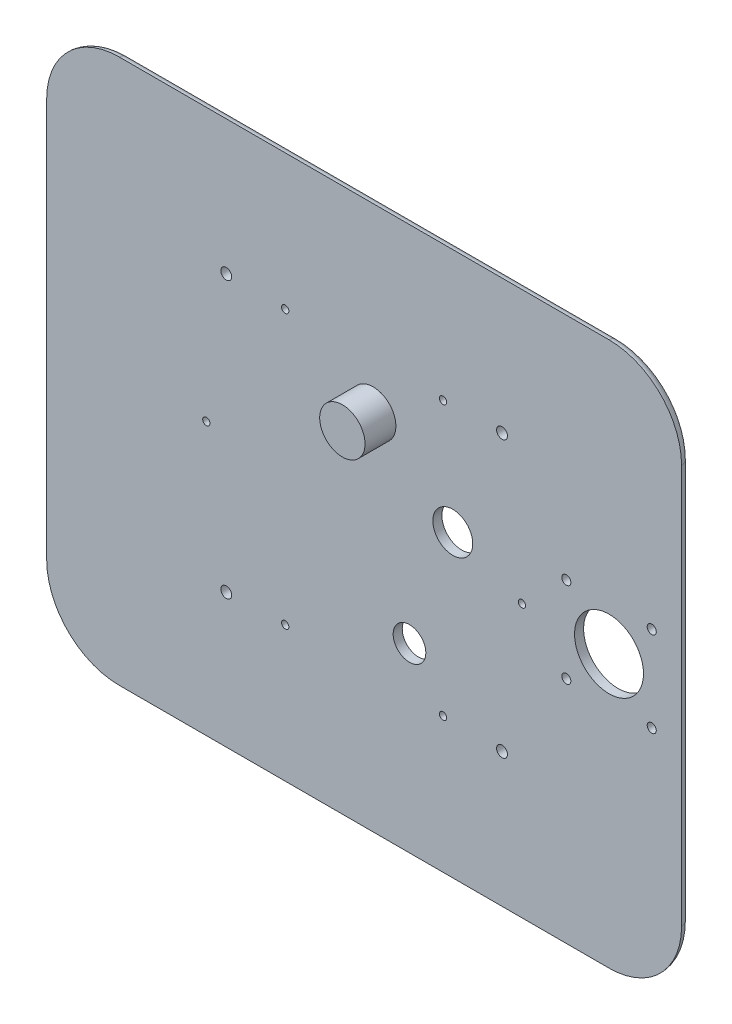
ISO-10303-21;
HEADER;
FILE_DESCRIPTION(('STEP AP214'),'2;1');
FILE_NAME('part.step','',(''),(''),'','','');
FILE_SCHEMA(('AUTOMOTIVE_DESIGN { 1 0 10303 214 1 1 1 1 }'));
ENDSEC;
DATA;
#1=APPLICATION_CONTEXT('core data for automotive mechanical design processes');
#2=APPLICATION_PROTOCOL_DEFINITION('international standard','automotive_design',2000,#1);
#3=PRODUCT_CONTEXT('',#1,'mechanical');
#4=PRODUCT('Part','Part','',(#3));
#5=PRODUCT_RELATED_PRODUCT_CATEGORY('part','',(#4));
#6=PRODUCT_DEFINITION_FORMATION('','',#4);
#7=PRODUCT_DEFINITION_CONTEXT('part definition',#1,'design');
#8=PRODUCT_DEFINITION('design','',#6,#7);
#9=PRODUCT_DEFINITION_SHAPE('','',#8);
#10=(LENGTH_UNIT() NAMED_UNIT(*) SI_UNIT(.MILLI.,.METRE.));
#11=(NAMED_UNIT(*) PLANE_ANGLE_UNIT() SI_UNIT($,.RADIAN.));
#12=(NAMED_UNIT(*) SI_UNIT($,.STERADIAN.) SOLID_ANGLE_UNIT());
#13=UNCERTAINTY_MEASURE_WITH_UNIT(LENGTH_MEASURE(1.E-05),#10,'distance_accuracy_value','');
#14=(GEOMETRIC_REPRESENTATION_CONTEXT(3) GLOBAL_UNCERTAINTY_ASSIGNED_CONTEXT((#13)) GLOBAL_UNIT_ASSIGNED_CONTEXT((#10,
#11,#12)) REPRESENTATION_CONTEXT('',''));
#15=CARTESIAN_POINT('',(0.,0.,0.));
#16=DIRECTION('',(0.,0.,1.));
#17=DIRECTION('',(1.,0.,0.));
#18=AXIS2_PLACEMENT_3D('',#15,#16,#17);
#19=CARTESIAN_POINT('',(0.,0.,5.));
#20=DIRECTION('',(0.,0.,1.));
#21=DIRECTION('',(1.,0.,0.));
#22=AXIS2_PLACEMENT_3D('',#19,#20,#21);
#23=PLANE('',#22);
#24=CARTESIAN_POINT('',(158.55,23.5499999999998,5.));
#25=DIRECTION('',(0.,0.,1.));
#26=DIRECTION('',(1.,0.,0.));
#27=AXIS2_PLACEMENT_3D('',#24,#25,#26);
#28=CIRCLE('',#27,2.49999999999999);
#29=CARTESIAN_POINT('',(161.05,23.5499999999998,5.));
#30=VERTEX_POINT('',#29);
#31=EDGE_CURVE('E171',#30,#30,#28,.T.);
#32=ORIENTED_EDGE('',*,*,#31,.F.);
#33=EDGE_LOOP('',(#32));
#34=FACE_BOUND('',#33,.T.);
#35=CARTESIAN_POINT('',(111.45,-23.5499999999999,5.));
#36=DIRECTION('',(0.,0.,1.));
#37=DIRECTION('',(1.,0.,0.));
#38=AXIS2_PLACEMENT_3D('',#35,#36,#37);
#39=CIRCLE('',#38,2.49999999999999);
#40=CARTESIAN_POINT('',(113.95,-23.5499999999999,5.));
#41=VERTEX_POINT('',#40);
#42=EDGE_CURVE('E185',#41,#41,#39,.T.);
#43=ORIENTED_EDGE('',*,*,#42,.F.);
#44=EDGE_LOOP('',(#43));
#45=FACE_BOUND('',#44,.T.);
#46=CARTESIAN_POINT('',(-76.0129579413931,76.015,5.));
#47=DIRECTION('',(0.,0.,1.));
#48=DIRECTION('',(1.,0.,0.));
#49=AXIS2_PLACEMENT_3D('',#46,#47,#48);
#50=CIRCLE('',#49,3.00000000000001);
#51=CARTESIAN_POINT('',(-73.0129579413931,76.015,5.));
#52=VERTEX_POINT('',#51);
#53=EDGE_CURVE('E197',#52,#52,#50,.T.);
#54=ORIENTED_EDGE('',*,*,#53,.F.);
#55=EDGE_LOOP('',(#54));
#56=FACE_BOUND('',#55,.T.);
#57=CARTESIAN_POINT('',(158.55,-23.55,5.));
#58=DIRECTION('',(0.,0.,1.));
#59=DIRECTION('',(1.,0.,0.));
#60=AXIS2_PLACEMENT_3D('',#57,#58,#59);
#61=CIRCLE('',#60,2.5);
#62=CARTESIAN_POINT('',(161.05,-23.55,5.));
#63=VERTEX_POINT('',#62);
#64=EDGE_CURVE('E209',#63,#63,#61,.T.);
#65=ORIENTED_EDGE('',*,*,#64,.F.);
#66=EDGE_LOOP('',(#65));
#67=FACE_BOUND('',#66,.T.);
#68=CARTESIAN_POINT('',(-76.0129579413931,-76.015,5.));
#69=DIRECTION('',(0.,0.,1.));
#70=DIRECTION('',(1.,0.,0.));
#71=AXIS2_PLACEMENT_3D('',#68,#69,#70);
#72=CIRCLE('',#71,3.00000000000001);
#73=CARTESIAN_POINT('',(-73.0129579413931,-76.015,5.));
#74=VERTEX_POINT('',#73);
#75=EDGE_CURVE('E221',#74,#74,#72,.T.);
#76=ORIENTED_EDGE('',*,*,#75,.F.);
#77=EDGE_LOOP('',(#76));
#78=FACE_BOUND('',#77,.T.);
#79=CARTESIAN_POINT('',(-43.4999999999998,-75.3442101292462,5.));
#80=DIRECTION('',(0.,0.,1.));
#81=DIRECTION('',(1.,0.,0.));
#82=AXIS2_PLACEMENT_3D('',#79,#80,#81);
#83=CIRCLE('',#82,2.);
#84=CARTESIAN_POINT('',(-41.4999999999998,-75.3442101292462,5.));
#85=VERTEX_POINT('',#84);
#86=EDGE_CURVE('E233',#85,#85,#83,.T.);
#87=ORIENTED_EDGE('',*,*,#86,.F.);
#88=EDGE_LOOP('',(#87));
#89=FACE_BOUND('',#88,.T.);
#90=CARTESIAN_POINT('',(87.,1.76012159040676E-13,5.));
#91=DIRECTION('',(0.,0.,1.));
#92=DIRECTION('',(1.,0.,0.));
#93=AXIS2_PLACEMENT_3D('',#90,#91,#92);
#94=CIRCLE('',#93,2.);
#95=CARTESIAN_POINT('',(89.,1.76012159040676E-13,5.));
#96=VERTEX_POINT('',#95);
#97=EDGE_CURVE('E245',#96,#96,#94,.T.);
#98=ORIENTED_EDGE('',*,*,#97,.F.);
#99=EDGE_LOOP('',(#98));
#100=FACE_BOUND('',#99,.T.);
#101=CARTESIAN_POINT('',(-43.5000000000002,75.3442101292461,5.));
#102=DIRECTION('',(0.,0.,1.));
#103=DIRECTION('',(1.,0.,0.));
#104=AXIS2_PLACEMENT_3D('',#101,#102,#103);
#105=CIRCLE('',#104,2.00000000000012);
#106=CARTESIAN_POINT('',(-41.5000000000001,75.3442101292461,5.));
#107=VERTEX_POINT('',#106);
#108=EDGE_CURVE('E257',#107,#107,#105,.T.);
#109=ORIENTED_EDGE('',*,*,#108,.F.);
#110=EDGE_LOOP('',(#109));
#111=FACE_BOUND('',#110,.T.);
#112=DIRECTION('',(0.,1.,0.));
#113=VECTOR('',#112,1.);
#114=CARTESIAN_POINT('',(175.,150.,5.));
#115=LINE('',#114,#113);
#116=CARTESIAN_POINT('',(175.,-110.,5.));
#117=VERTEX_POINT('',#116);
#118=CARTESIAN_POINT('',(175.,110.,5.));
#119=VERTEX_POINT('',#118);
#120=EDGE_CURVE('E116',#117,#119,#115,.T.);
#121=ORIENTED_EDGE('',*,*,#120,.T.);
#122=CARTESIAN_POINT('',(135.,110.,5.));
#123=DIRECTION('',(0.,0.,1.));
#124=DIRECTION('',(1.,0.,0.));
#125=AXIS2_PLACEMENT_3D('',#122,#123,#124);
#126=CIRCLE('',#125,40.);
#127=CARTESIAN_POINT('',(135.,150.,5.));
#128=VERTEX_POINT('',#127);
#129=EDGE_CURVE('E103',#119,#128,#126,.T.);
#130=ORIENTED_EDGE('',*,*,#129,.T.);
#131=DIRECTION('',(-1.,0.,0.));
#132=VECTOR('',#131,1.);
#133=CARTESIAN_POINT('',(-175.,150.,5.));
#134=LINE('',#133,#132);
#135=CARTESIAN_POINT('',(-135.,150.,5.));
#136=VERTEX_POINT('',#135);
#137=EDGE_CURVE('E109',#128,#136,#134,.T.);
#138=ORIENTED_EDGE('',*,*,#137,.T.);
#139=CARTESIAN_POINT('',(-135.,110.,5.));
#140=DIRECTION('',(0.,0.,1.));
#141=DIRECTION('',(1.,0.,0.));
#142=AXIS2_PLACEMENT_3D('',#139,#140,#141);
#143=CIRCLE('',#142,40.);
#144=CARTESIAN_POINT('',(-175.,110.,5.));
#145=VERTEX_POINT('',#144);
#146=EDGE_CURVE('E121',#136,#145,#143,.T.);
#147=ORIENTED_EDGE('',*,*,#146,.T.);
#148=DIRECTION('',(0.,-1.,0.));
#149=VECTOR('',#148,1.);
#150=CARTESIAN_POINT('',(-175.,150.,5.));
#151=LINE('',#150,#149);
#152=CARTESIAN_POINT('',(-175.,-110.,5.));
#153=VERTEX_POINT('',#152);
#154=EDGE_CURVE('E115',#145,#153,#151,.T.);
#155=ORIENTED_EDGE('',*,*,#154,.T.);
#156=CARTESIAN_POINT('',(-135.,-110.,5.));
#157=DIRECTION('',(0.,0.,1.));
#158=DIRECTION('',(1.,0.,0.));
#159=AXIS2_PLACEMENT_3D('',#156,#157,#158);
#160=CIRCLE('',#159,40.);
#161=CARTESIAN_POINT('',(-135.,-150.,5.));
#162=VERTEX_POINT('',#161);
#163=EDGE_CURVE('E125',#153,#162,#160,.T.);
#164=ORIENTED_EDGE('',*,*,#163,.T.);
#165=DIRECTION('',(1.,0.,0.));
#166=VECTOR('',#165,1.);
#167=CARTESIAN_POINT('',(-175.,-150.,5.));
#168=LINE('',#167,#166);
#169=CARTESIAN_POINT('',(135.,-150.,5.));
#170=VERTEX_POINT('',#169);
#171=EDGE_CURVE('E264',#162,#170,#168,.T.);
#172=ORIENTED_EDGE('',*,*,#171,.T.);
#173=CARTESIAN_POINT('',(135.,-110.,5.));
#174=DIRECTION('',(0.,0.,1.));
#175=DIRECTION('',(1.,0.,0.));
#176=AXIS2_PLACEMENT_3D('',#173,#174,#175);
#177=CIRCLE('',#176,40.);
#178=EDGE_CURVE('E266',#170,#117,#177,.T.);
#179=ORIENTED_EDGE('',*,*,#178,.T.);
#180=EDGE_LOOP('',(#121,#130,#138,#147,#155,#164,#172,#179));
#181=FACE_BOUND('',#180,.T.);
#182=CARTESIAN_POINT('',(43.4999999999998,75.3442101292462,5.));
#183=DIRECTION('',(0.,0.,1.));
#184=DIRECTION('',(1.,0.,0.));
#185=AXIS2_PLACEMENT_3D('',#182,#183,#184);
#186=CIRCLE('',#185,2.);
#187=CARTESIAN_POINT('',(45.4999999999998,75.3442101292462,5.));
#188=VERTEX_POINT('',#187);
#189=EDGE_CURVE('E251',#188,#188,#186,.T.);
#190=ORIENTED_EDGE('',*,*,#189,.F.);
#191=EDGE_LOOP('',(#190));
#192=FACE_BOUND('',#191,.T.);
#193=CARTESIAN_POINT('',(43.5000000000001,-75.3442101292461,5.));
#194=DIRECTION('',(0.,0.,1.));
#195=DIRECTION('',(1.,0.,0.));
#196=AXIS2_PLACEMENT_3D('',#193,#194,#195);
#197=CIRCLE('',#196,2.);
#198=CARTESIAN_POINT('',(45.5000000000001,-75.3442101292461,5.));
#199=VERTEX_POINT('',#198);
#200=EDGE_CURVE('E239',#199,#199,#197,.T.);
#201=ORIENTED_EDGE('',*,*,#200,.F.);
#202=EDGE_LOOP('',(#201));
#203=FACE_BOUND('',#202,.T.);
#204=CARTESIAN_POINT('',(-87.,-2.24584416368026E-13,5.));
#205=DIRECTION('',(0.,0.,1.));
#206=DIRECTION('',(1.,0.,0.));
#207=AXIS2_PLACEMENT_3D('',#204,#205,#206);
#208=CIRCLE('',#207,2.);
#209=CARTESIAN_POINT('',(-85.,-2.24584416368026E-13,5.));
#210=VERTEX_POINT('',#209);
#211=EDGE_CURVE('E227',#210,#210,#208,.T.);
#212=ORIENTED_EDGE('',*,*,#211,.F.);
#213=EDGE_LOOP('',(#212));
#214=FACE_BOUND('',#213,.T.);
#215=CARTESIAN_POINT('',(135.,0.,5.));
#216=DIRECTION('',(0.,0.,1.));
#217=DIRECTION('',(1.,0.,0.));
#218=AXIS2_PLACEMENT_3D('',#215,#216,#217);
#219=CIRCLE('',#218,19.);
#220=CARTESIAN_POINT('',(154.,0.,5.));
#221=VERTEX_POINT('',#220);
#222=EDGE_CURVE('E215',#221,#221,#219,.T.);
#223=ORIENTED_EDGE('',*,*,#222,.F.);
#224=EDGE_LOOP('',(#223));
#225=FACE_BOUND('',#224,.T.);
#226=CARTESIAN_POINT('',(76.0129579413931,76.015,5.));
#227=DIRECTION('',(0.,0.,1.));
#228=DIRECTION('',(1.,0.,0.));
#229=AXIS2_PLACEMENT_3D('',#226,#227,#228);
#230=CIRCLE('',#229,3.00000000000001);
#231=CARTESIAN_POINT('',(79.0129579413931,76.015,5.));
#232=VERTEX_POINT('',#231);
#233=EDGE_CURVE('E203',#232,#232,#230,.T.);
#234=ORIENTED_EDGE('',*,*,#233,.F.);
#235=EDGE_LOOP('',(#234));
#236=FACE_BOUND('',#235,.T.);
#237=CARTESIAN_POINT('',(76.0129579413931,-76.015,5.));
#238=DIRECTION('',(0.,0.,1.));
#239=DIRECTION('',(1.,0.,0.));
#240=AXIS2_PLACEMENT_3D('',#237,#238,#239);
#241=CIRCLE('',#240,3.00000000000001);
#242=CARTESIAN_POINT('',(79.0129579413931,-76.015,5.));
#243=VERTEX_POINT('',#242);
#244=EDGE_CURVE('E191',#243,#243,#241,.T.);
#245=ORIENTED_EDGE('',*,*,#244,.F.);
#246=EDGE_LOOP('',(#245));
#247=FACE_BOUND('',#246,.T.);
#248=CARTESIAN_POINT('',(111.45,23.5500000000002,5.));
#249=DIRECTION('',(0.,0.,1.));
#250=DIRECTION('',(1.,0.,0.));
#251=AXIS2_PLACEMENT_3D('',#248,#249,#250);
#252=CIRCLE('',#251,2.49999999999999);
#253=CARTESIAN_POINT('',(113.95,23.5500000000002,5.));
#254=VERTEX_POINT('',#253);
#255=EDGE_CURVE('E179',#254,#254,#252,.T.);
#256=ORIENTED_EDGE('',*,*,#255,.F.);
#257=EDGE_LOOP('',(#256));
#258=FACE_BOUND('',#257,.T.);
#259=CARTESIAN_POINT('',(25.,-50.,5.));
#260=DIRECTION('',(0.,0.,1.));
#261=DIRECTION('',(1.,0.,0.));
#262=AXIS2_PLACEMENT_3D('',#259,#260,#261);
#263=CIRCLE('',#262,9.);
#264=CARTESIAN_POINT('',(34.,-50.,5.));
#265=VERTEX_POINT('',#264);
#266=EDGE_CURVE('E162',#265,#265,#263,.F.);
#267=ORIENTED_EDGE('',*,*,#266,.T.);
#268=EDGE_LOOP('',(#267));
#269=FACE_BOUND('',#268,.T.);
#270=CARTESIAN_POINT('',(48.87,15.,5.));
#271=DIRECTION('',(0.,0.,1.));
#272=DIRECTION('',(1.,0.,0.));
#273=AXIS2_PLACEMENT_3D('',#270,#271,#272);
#274=CIRCLE('',#273,11.);
#275=CARTESIAN_POINT('',(59.87,15.,5.));
#276=VERTEX_POINT('',#275);
#277=EDGE_CURVE('E644',#276,#276,#274,.F.);
#278=ORIENTED_EDGE('',*,*,#277,.T.);
#279=EDGE_LOOP('',(#278));
#280=FACE_BOUND('',#279,.T.);
#281=CARTESIAN_POINT('',(4.99999999999995,50.,5.));
#282=DIRECTION('',(0.,0.,1.));
#283=DIRECTION('',(1.,0.,0.));
#284=AXIS2_PLACEMENT_3D('',#281,#282,#283);
#285=CIRCLE('',#284,12.5);
#286=CARTESIAN_POINT('',(17.5,50.,5.));
#287=VERTEX_POINT('',#286);
#288=EDGE_CURVE('E139',#287,#287,#285,.T.);
#289=ORIENTED_EDGE('',*,*,#288,.F.);
#290=EDGE_LOOP('',(#289));
#291=FACE_BOUND('',#290,.T.);
#292=ADVANCED_FACE('F34',(#34,#45,#56,#67,#78,#89,#100,#111,#181,#192,#203,#214,#225,#236,#247,
#258,#269,#280,#291),#23,.T.);
#293=CARTESIAN_POINT('',(0.,0.,0.));
#294=DIRECTION('',(0.,0.,1.));
#295=DIRECTION('',(1.,0.,0.));
#296=AXIS2_PLACEMENT_3D('',#293,#294,#295);
#297=PLANE('',#296);
#298=DIRECTION('',(-1.,0.,0.));
#299=VECTOR('',#298,1.);
#300=CARTESIAN_POINT('',(0.,145.,0.));
#301=LINE('',#300,#299);
#302=CARTESIAN_POINT('',(-135.,145.,0.));
#303=VERTEX_POINT('',#302);
#304=CARTESIAN_POINT('',(135.,145.,0.));
#305=VERTEX_POINT('',#304);
#306=EDGE_CURVE('E120',#303,#305,#301,.F.);
#307=ORIENTED_EDGE('',*,*,#306,.T.);
#308=CARTESIAN_POINT('',(135.,110.,0.));
#309=DIRECTION('',(0.,0.,1.));
#310=DIRECTION('',(1.,0.,0.));
#311=AXIS2_PLACEMENT_3D('',#308,#309,#310);
#312=CIRCLE('',#311,35.);
#313=CARTESIAN_POINT('',(170.,110.,0.));
#314=VERTEX_POINT('',#313);
#315=EDGE_CURVE('E11',#305,#314,#312,.F.);
#316=ORIENTED_EDGE('',*,*,#315,.T.);
#317=DIRECTION('',(0.,1.,0.));
#318=VECTOR('',#317,1.);
#319=CARTESIAN_POINT('',(170.,0.,0.));
#320=LINE('',#319,#318);
#321=CARTESIAN_POINT('',(170.,-110.,0.));
#322=VERTEX_POINT('',#321);
#323=EDGE_CURVE('E43',#314,#322,#320,.F.);
#324=ORIENTED_EDGE('',*,*,#323,.T.);
#325=CARTESIAN_POINT('',(135.,-110.,0.));
#326=DIRECTION('',(0.,0.,1.));
#327=DIRECTION('',(1.,0.,0.));
#328=AXIS2_PLACEMENT_3D('',#325,#326,#327);
#329=CIRCLE('',#328,35.);
#330=CARTESIAN_POINT('',(135.,-145.,0.));
#331=VERTEX_POINT('',#330);
#332=EDGE_CURVE('E136',#322,#331,#329,.F.);
#333=ORIENTED_EDGE('',*,*,#332,.T.);
#334=DIRECTION('',(1.,0.,0.));
#335=VECTOR('',#334,1.);
#336=CARTESIAN_POINT('',(0.,-145.,0.));
#337=LINE('',#336,#335);
#338=CARTESIAN_POINT('',(-135.,-145.,0.));
#339=VERTEX_POINT('',#338);
#340=EDGE_CURVE('E134',#331,#339,#337,.F.);
#341=ORIENTED_EDGE('',*,*,#340,.T.);
#342=CARTESIAN_POINT('',(-135.,-110.,0.));
#343=DIRECTION('',(0.,0.,1.));
#344=DIRECTION('',(1.,0.,0.));
#345=AXIS2_PLACEMENT_3D('',#342,#343,#344);
#346=CIRCLE('',#345,35.);
#347=CARTESIAN_POINT('',(-170.,-110.,0.));
#348=VERTEX_POINT('',#347);
#349=EDGE_CURVE('E132',#339,#348,#346,.F.);
#350=ORIENTED_EDGE('',*,*,#349,.T.);
#351=DIRECTION('',(0.,-1.,0.));
#352=VECTOR('',#351,1.);
#353=CARTESIAN_POINT('',(-170.,0.,0.));
#354=LINE('',#353,#352);
#355=CARTESIAN_POINT('',(-170.,110.,0.));
#356=VERTEX_POINT('',#355);
#357=EDGE_CURVE('E130',#348,#356,#354,.F.);
#358=ORIENTED_EDGE('',*,*,#357,.T.);
#359=CARTESIAN_POINT('',(-135.,110.,0.));
#360=DIRECTION('',(0.,0.,1.));
#361=DIRECTION('',(1.,0.,0.));
#362=AXIS2_PLACEMENT_3D('',#359,#360,#361);
#363=CIRCLE('',#362,35.);
#364=EDGE_CURVE('E123',#356,#303,#363,.F.);
#365=ORIENTED_EDGE('',*,*,#364,.T.);
#366=EDGE_LOOP('',(#307,#316,#324,#333,#341,#350,#358,#365));
#367=FACE_BOUND('',#366,.T.);
#368=CARTESIAN_POINT('',(48.87,15.,0.));
#369=DIRECTION('',(0.,0.,-1.));
#370=DIRECTION('',(-1.,0.,0.));
#371=AXIS2_PLACEMENT_3D('',#368,#369,#370);
#372=CIRCLE('',#371,11.);
#373=CARTESIAN_POINT('',(37.87,15.,0.));
#374=VERTEX_POINT('',#373);
#375=EDGE_CURVE('E178',#374,#374,#372,.T.);
#376=ORIENTED_EDGE('',*,*,#375,.F.);
#377=EDGE_LOOP('',(#376));
#378=FACE_BOUND('',#377,.T.);
#379=CARTESIAN_POINT('',(25.,-50.,0.));
#380=DIRECTION('',(0.,0.,-1.));
#381=DIRECTION('',(-1.,0.,0.));
#382=AXIS2_PLACEMENT_3D('',#379,#380,#381);
#383=CIRCLE('',#382,9.);
#384=CARTESIAN_POINT('',(16.,-50.,0.));
#385=VERTEX_POINT('',#384);
#386=EDGE_CURVE('E167',#385,#385,#383,.T.);
#387=ORIENTED_EDGE('',*,*,#386,.F.);
#388=EDGE_LOOP('',(#387));
#389=FACE_BOUND('',#388,.T.);
#390=CARTESIAN_POINT('',(4.99999999999995,50.,0.));
#391=DIRECTION('',(0.,0.,-1.));
#392=DIRECTION('',(-1.,0.,0.));
#393=AXIS2_PLACEMENT_3D('',#390,#391,#392);
#394=CIRCLE('',#393,10.);
#395=CARTESIAN_POINT('',(-5.00000000000006,50.,0.));
#396=VERTEX_POINT('',#395);
#397=EDGE_CURVE('E156',#396,#396,#394,.T.);
#398=ORIENTED_EDGE('',*,*,#397,.F.);
#399=EDGE_LOOP('',(#398));
#400=FACE_BOUND('',#399,.T.);
#401=CARTESIAN_POINT('',(-43.5000000000002,75.3442101292461,0.));
#402=DIRECTION('',(0.,0.,1.));
#403=DIRECTION('',(1.,0.,0.));
#404=AXIS2_PLACEMENT_3D('',#401,#402,#403);
#405=CIRCLE('',#404,2.00000000000012);
#406=CARTESIAN_POINT('',(-41.5000000000001,75.3442101292461,0.));
#407=VERTEX_POINT('',#406);
#408=EDGE_CURVE('E254',#407,#407,#405,.T.);
#409=ORIENTED_EDGE('',*,*,#408,.T.);
#410=EDGE_LOOP('',(#409));
#411=FACE_BOUND('',#410,.T.);
#412=CARTESIAN_POINT('',(43.4999999999998,75.3442101292462,0.));
#413=DIRECTION('',(0.,0.,1.));
#414=DIRECTION('',(1.,0.,0.));
#415=AXIS2_PLACEMENT_3D('',#412,#413,#414);
#416=CIRCLE('',#415,2.);
#417=CARTESIAN_POINT('',(45.4999999999998,75.3442101292462,0.));
#418=VERTEX_POINT('',#417);
#419=EDGE_CURVE('E248',#418,#418,#416,.T.);
#420=ORIENTED_EDGE('',*,*,#419,.T.);
#421=EDGE_LOOP('',(#420));
#422=FACE_BOUND('',#421,.T.);
#423=CARTESIAN_POINT('',(87.,1.76012159040676E-13,0.));
#424=DIRECTION('',(0.,0.,1.));
#425=DIRECTION('',(1.,0.,0.));
#426=AXIS2_PLACEMENT_3D('',#423,#424,#425);
#427=CIRCLE('',#426,2.);
#428=CARTESIAN_POINT('',(89.,1.76012159040676E-13,0.));
#429=VERTEX_POINT('',#428);
#430=EDGE_CURVE('E242',#429,#429,#427,.T.);
#431=ORIENTED_EDGE('',*,*,#430,.T.);
#432=EDGE_LOOP('',(#431));
#433=FACE_BOUND('',#432,.T.);
#434=CARTESIAN_POINT('',(43.5000000000001,-75.3442101292461,0.));
#435=DIRECTION('',(0.,0.,1.));
#436=DIRECTION('',(1.,0.,0.));
#437=AXIS2_PLACEMENT_3D('',#434,#435,#436);
#438=CIRCLE('',#437,2.);
#439=CARTESIAN_POINT('',(45.5000000000001,-75.3442101292461,0.));
#440=VERTEX_POINT('',#439);
#441=EDGE_CURVE('E236',#440,#440,#438,.T.);
#442=ORIENTED_EDGE('',*,*,#441,.T.);
#443=EDGE_LOOP('',(#442));
#444=FACE_BOUND('',#443,.T.);
#445=CARTESIAN_POINT('',(-43.4999999999998,-75.3442101292462,0.));
#446=DIRECTION('',(0.,0.,1.));
#447=DIRECTION('',(1.,0.,0.));
#448=AXIS2_PLACEMENT_3D('',#445,#446,#447);
#449=CIRCLE('',#448,2.);
#450=CARTESIAN_POINT('',(-41.4999999999998,-75.3442101292462,0.));
#451=VERTEX_POINT('',#450);
#452=EDGE_CURVE('E230',#451,#451,#449,.T.);
#453=ORIENTED_EDGE('',*,*,#452,.T.);
#454=EDGE_LOOP('',(#453));
#455=FACE_BOUND('',#454,.T.);
#456=CARTESIAN_POINT('',(-87.,-2.24584416368026E-13,0.));
#457=DIRECTION('',(0.,0.,1.));
#458=DIRECTION('',(1.,0.,0.));
#459=AXIS2_PLACEMENT_3D('',#456,#457,#458);
#460=CIRCLE('',#459,2.);
#461=CARTESIAN_POINT('',(-85.,-2.24584416368026E-13,0.));
#462=VERTEX_POINT('',#461);
#463=EDGE_CURVE('E224',#462,#462,#460,.T.);
#464=ORIENTED_EDGE('',*,*,#463,.T.);
#465=EDGE_LOOP('',(#464));
#466=FACE_BOUND('',#465,.T.);
#467=CARTESIAN_POINT('',(-76.0129579413931,-76.015,0.));
#468=DIRECTION('',(0.,0.,1.));
#469=DIRECTION('',(1.,0.,0.));
#470=AXIS2_PLACEMENT_3D('',#467,#468,#469);
#471=CIRCLE('',#470,3.00000000000001);
#472=CARTESIAN_POINT('',(-73.0129579413931,-76.015,0.));
#473=VERTEX_POINT('',#472);
#474=EDGE_CURVE('E218',#473,#473,#471,.T.);
#475=ORIENTED_EDGE('',*,*,#474,.T.);
#476=EDGE_LOOP('',(#475));
#477=FACE_BOUND('',#476,.T.);
#478=CARTESIAN_POINT('',(135.,0.,0.));
#479=DIRECTION('',(0.,0.,1.));
#480=DIRECTION('',(1.,0.,0.));
#481=AXIS2_PLACEMENT_3D('',#478,#479,#480);
#482=CIRCLE('',#481,19.);
#483=CARTESIAN_POINT('',(154.,0.,0.));
#484=VERTEX_POINT('',#483);
#485=EDGE_CURVE('E212',#484,#484,#482,.T.);
#486=ORIENTED_EDGE('',*,*,#485,.T.);
#487=EDGE_LOOP('',(#486));
#488=FACE_BOUND('',#487,.T.);
#489=CARTESIAN_POINT('',(158.55,-23.55,0.));
#490=DIRECTION('',(0.,0.,1.));
#491=DIRECTION('',(1.,0.,0.));
#492=AXIS2_PLACEMENT_3D('',#489,#490,#491);
#493=CIRCLE('',#492,2.5);
#494=CARTESIAN_POINT('',(161.05,-23.55,0.));
#495=VERTEX_POINT('',#494);
#496=EDGE_CURVE('E206',#495,#495,#493,.T.);
#497=ORIENTED_EDGE('',*,*,#496,.T.);
#498=EDGE_LOOP('',(#497));
#499=FACE_BOUND('',#498,.T.);
#500=CARTESIAN_POINT('',(76.0129579413931,76.015,0.));
#501=DIRECTION('',(0.,0.,1.));
#502=DIRECTION('',(1.,0.,0.));
#503=AXIS2_PLACEMENT_3D('',#500,#501,#502);
#504=CIRCLE('',#503,3.00000000000001);
#505=CARTESIAN_POINT('',(79.0129579413931,76.015,0.));
#506=VERTEX_POINT('',#505);
#507=EDGE_CURVE('E200',#506,#506,#504,.T.);
#508=ORIENTED_EDGE('',*,*,#507,.T.);
#509=EDGE_LOOP('',(#508));
#510=FACE_BOUND('',#509,.T.);
#511=CARTESIAN_POINT('',(-76.0129579413931,76.015,0.));
#512=DIRECTION('',(0.,0.,1.));
#513=DIRECTION('',(1.,0.,0.));
#514=AXIS2_PLACEMENT_3D('',#511,#512,#513);
#515=CIRCLE('',#514,3.00000000000001);
#516=CARTESIAN_POINT('',(-73.0129579413931,76.015,0.));
#517=VERTEX_POINT('',#516);
#518=EDGE_CURVE('E194',#517,#517,#515,.T.);
#519=ORIENTED_EDGE('',*,*,#518,.T.);
#520=EDGE_LOOP('',(#519));
#521=FACE_BOUND('',#520,.T.);
#522=CARTESIAN_POINT('',(76.0129579413931,-76.015,0.));
#523=DIRECTION('',(0.,0.,1.));
#524=DIRECTION('',(1.,0.,0.));
#525=AXIS2_PLACEMENT_3D('',#522,#523,#524);
#526=CIRCLE('',#525,3.00000000000001);
#527=CARTESIAN_POINT('',(79.0129579413931,-76.015,0.));
#528=VERTEX_POINT('',#527);
#529=EDGE_CURVE('E188',#528,#528,#526,.T.);
#530=ORIENTED_EDGE('',*,*,#529,.T.);
#531=EDGE_LOOP('',(#530));
#532=FACE_BOUND('',#531,.T.);
#533=CARTESIAN_POINT('',(111.45,-23.5499999999999,0.));
#534=DIRECTION('',(0.,0.,1.));
#535=DIRECTION('',(1.,0.,0.));
#536=AXIS2_PLACEMENT_3D('',#533,#534,#535);
#537=CIRCLE('',#536,2.49999999999999);
#538=CARTESIAN_POINT('',(113.95,-23.5499999999999,0.));
#539=VERTEX_POINT('',#538);
#540=EDGE_CURVE('E182',#539,#539,#537,.T.);
#541=ORIENTED_EDGE('',*,*,#540,.T.);
#542=EDGE_LOOP('',(#541));
#543=FACE_BOUND('',#542,.T.);
#544=CARTESIAN_POINT('',(111.45,23.5500000000002,0.));
#545=DIRECTION('',(0.,0.,1.));
#546=DIRECTION('',(1.,0.,0.));
#547=AXIS2_PLACEMENT_3D('',#544,#545,#546);
#548=CIRCLE('',#547,2.49999999999999);
#549=CARTESIAN_POINT('',(113.95,23.5500000000002,0.));
#550=VERTEX_POINT('',#549);
#551=EDGE_CURVE('E174',#550,#550,#548,.T.);
#552=ORIENTED_EDGE('',*,*,#551,.T.);
#553=EDGE_LOOP('',(#552));
#554=FACE_BOUND('',#553,.T.);
#555=CARTESIAN_POINT('',(158.55,23.5499999999998,0.));
#556=DIRECTION('',(0.,0.,1.));
#557=DIRECTION('',(1.,0.,0.));
#558=AXIS2_PLACEMENT_3D('',#555,#556,#557);
#559=CIRCLE('',#558,2.49999999999999);
#560=CARTESIAN_POINT('',(161.05,23.5499999999998,0.));
#561=VERTEX_POINT('',#560);
#562=EDGE_CURVE('E175',#561,#561,#559,.T.);
#563=ORIENTED_EDGE('',*,*,#562,.T.);
#564=EDGE_LOOP('',(#563));
#565=FACE_BOUND('',#564,.T.);
#566=ADVANCED_FACE('F278',(#367,#378,#389,#400,#411,#422,#433,#444,#455,#466,#477,#488,#499,
#510,#521,#532,#543,#554,#565),#297,.F.);
#567=CARTESIAN_POINT('',(-43.5000000000002,75.3442101292461,5.));
#568=DIRECTION('',(0.,0.,-1.));
#569=DIRECTION('',(-1.,0.,0.));
#570=AXIS2_PLACEMENT_3D('',#567,#568,#569);
#571=CYLINDRICAL_SURFACE('',#570,2.00000000000012);
#572=ORIENTED_EDGE('',*,*,#108,.T.);
#573=EDGE_LOOP('',(#572));
#574=FACE_BOUND('',#573,.T.);
#575=ORIENTED_EDGE('',*,*,#408,.F.);
#576=EDGE_LOOP('',(#575));
#577=FACE_BOUND('',#576,.T.);
#578=ADVANCED_FACE('F298',(#574,#577),#571,.F.);
#579=CARTESIAN_POINT('',(43.4999999999998,75.3442101292462,5.));
#580=DIRECTION('',(0.,0.,-1.));
#581=DIRECTION('',(-1.,0.,0.));
#582=AXIS2_PLACEMENT_3D('',#579,#580,#581);
#583=CYLINDRICAL_SURFACE('',#582,2.);
#584=ORIENTED_EDGE('',*,*,#189,.T.);
#585=EDGE_LOOP('',(#584));
#586=FACE_BOUND('',#585,.T.);
#587=ORIENTED_EDGE('',*,*,#419,.F.);
#588=EDGE_LOOP('',(#587));
#589=FACE_BOUND('',#588,.T.);
#590=ADVANCED_FACE('F552',(#586,#589),#583,.F.);
#591=CARTESIAN_POINT('',(87.,1.76012159040676E-13,5.));
#592=DIRECTION('',(0.,0.,-1.));
#593=DIRECTION('',(-1.,0.,0.));
#594=AXIS2_PLACEMENT_3D('',#591,#592,#593);
#595=CYLINDRICAL_SURFACE('',#594,2.);
#596=ORIENTED_EDGE('',*,*,#97,.T.);
#597=EDGE_LOOP('',(#596));
#598=FACE_BOUND('',#597,.T.);
#599=ORIENTED_EDGE('',*,*,#430,.F.);
#600=EDGE_LOOP('',(#599));
#601=FACE_BOUND('',#600,.T.);
#602=ADVANCED_FACE('F542',(#598,#601),#595,.F.);
#603=CARTESIAN_POINT('',(43.5000000000001,-75.3442101292461,5.));
#604=DIRECTION('',(0.,0.,-1.));
#605=DIRECTION('',(-1.,0.,0.));
#606=AXIS2_PLACEMENT_3D('',#603,#604,#605);
#607=CYLINDRICAL_SURFACE('',#606,2.);
#608=ORIENTED_EDGE('',*,*,#200,.T.);
#609=EDGE_LOOP('',(#608));
#610=FACE_BOUND('',#609,.T.);
#611=ORIENTED_EDGE('',*,*,#441,.F.);
#612=EDGE_LOOP('',(#611));
#613=FACE_BOUND('',#612,.T.);
#614=ADVANCED_FACE('F532',(#610,#613),#607,.F.);
#615=CARTESIAN_POINT('',(-43.4999999999998,-75.3442101292462,5.));
#616=DIRECTION('',(0.,0.,-1.));
#617=DIRECTION('',(-1.,0.,0.));
#618=AXIS2_PLACEMENT_3D('',#615,#616,#617);
#619=CYLINDRICAL_SURFACE('',#618,2.);
#620=ORIENTED_EDGE('',*,*,#86,.T.);
#621=EDGE_LOOP('',(#620));
#622=FACE_BOUND('',#621,.T.);
#623=ORIENTED_EDGE('',*,*,#452,.F.);
#624=EDGE_LOOP('',(#623));
#625=FACE_BOUND('',#624,.T.);
#626=ADVANCED_FACE('F522',(#622,#625),#619,.F.);
#627=CARTESIAN_POINT('',(-87.,-2.24584416368026E-13,5.));
#628=DIRECTION('',(0.,0.,-1.));
#629=DIRECTION('',(-1.,0.,0.));
#630=AXIS2_PLACEMENT_3D('',#627,#628,#629);
#631=CYLINDRICAL_SURFACE('',#630,2.);
#632=ORIENTED_EDGE('',*,*,#211,.T.);
#633=EDGE_LOOP('',(#632));
#634=FACE_BOUND('',#633,.T.);
#635=ORIENTED_EDGE('',*,*,#463,.F.);
#636=EDGE_LOOP('',(#635));
#637=FACE_BOUND('',#636,.T.);
#638=ADVANCED_FACE('F512',(#634,#637),#631,.F.);
#639=CARTESIAN_POINT('',(-76.0129579413931,-76.015,5.));
#640=DIRECTION('',(0.,0.,-1.));
#641=DIRECTION('',(-1.,0.,0.));
#642=AXIS2_PLACEMENT_3D('',#639,#640,#641);
#643=CYLINDRICAL_SURFACE('',#642,3.00000000000001);
#644=ORIENTED_EDGE('',*,*,#75,.T.);
#645=EDGE_LOOP('',(#644));
#646=FACE_BOUND('',#645,.T.);
#647=ORIENTED_EDGE('',*,*,#474,.F.);
#648=EDGE_LOOP('',(#647));
#649=FACE_BOUND('',#648,.T.);
#650=ADVANCED_FACE('F502',(#646,#649),#643,.F.);
#651=CARTESIAN_POINT('',(135.,0.,5.));
#652=DIRECTION('',(0.,0.,-1.));
#653=DIRECTION('',(-1.,0.,0.));
#654=AXIS2_PLACEMENT_3D('',#651,#652,#653);
#655=CYLINDRICAL_SURFACE('',#654,19.);
#656=ORIENTED_EDGE('',*,*,#222,.T.);
#657=EDGE_LOOP('',(#656));
#658=FACE_BOUND('',#657,.T.);
#659=ORIENTED_EDGE('',*,*,#485,.F.);
#660=EDGE_LOOP('',(#659));
#661=FACE_BOUND('',#660,.T.);
#662=ADVANCED_FACE('F492',(#658,#661),#655,.F.);
#663=CARTESIAN_POINT('',(158.55,-23.55,5.));
#664=DIRECTION('',(0.,0.,-1.));
#665=DIRECTION('',(-1.,0.,0.));
#666=AXIS2_PLACEMENT_3D('',#663,#664,#665);
#667=CYLINDRICAL_SURFACE('',#666,2.5);
#668=ORIENTED_EDGE('',*,*,#64,.T.);
#669=EDGE_LOOP('',(#668));
#670=FACE_BOUND('',#669,.T.);
#671=ORIENTED_EDGE('',*,*,#496,.F.);
#672=EDGE_LOOP('',(#671));
#673=FACE_BOUND('',#672,.T.);
#674=ADVANCED_FACE('F482',(#670,#673),#667,.F.);
#675=CARTESIAN_POINT('',(76.0129579413931,76.015,5.));
#676=DIRECTION('',(0.,0.,-1.));
#677=DIRECTION('',(-1.,0.,0.));
#678=AXIS2_PLACEMENT_3D('',#675,#676,#677);
#679=CYLINDRICAL_SURFACE('',#678,3.00000000000001);
#680=ORIENTED_EDGE('',*,*,#233,.T.);
#681=EDGE_LOOP('',(#680));
#682=FACE_BOUND('',#681,.T.);
#683=ORIENTED_EDGE('',*,*,#507,.F.);
#684=EDGE_LOOP('',(#683));
#685=FACE_BOUND('',#684,.T.);
#686=ADVANCED_FACE('F472',(#682,#685),#679,.F.);
#687=CARTESIAN_POINT('',(-76.0129579413931,76.015,5.));
#688=DIRECTION('',(0.,0.,-1.));
#689=DIRECTION('',(-1.,0.,0.));
#690=AXIS2_PLACEMENT_3D('',#687,#688,#689);
#691=CYLINDRICAL_SURFACE('',#690,3.00000000000001);
#692=ORIENTED_EDGE('',*,*,#53,.T.);
#693=EDGE_LOOP('',(#692));
#694=FACE_BOUND('',#693,.T.);
#695=ORIENTED_EDGE('',*,*,#518,.F.);
#696=EDGE_LOOP('',(#695));
#697=FACE_BOUND('',#696,.T.);
#698=ADVANCED_FACE('F462',(#694,#697),#691,.F.);
#699=CARTESIAN_POINT('',(76.0129579413931,-76.015,5.));
#700=DIRECTION('',(0.,0.,-1.));
#701=DIRECTION('',(-1.,0.,0.));
#702=AXIS2_PLACEMENT_3D('',#699,#700,#701);
#703=CYLINDRICAL_SURFACE('',#702,3.00000000000001);
#704=ORIENTED_EDGE('',*,*,#244,.T.);
#705=EDGE_LOOP('',(#704));
#706=FACE_BOUND('',#705,.T.);
#707=ORIENTED_EDGE('',*,*,#529,.F.);
#708=EDGE_LOOP('',(#707));
#709=FACE_BOUND('',#708,.T.);
#710=ADVANCED_FACE('F452',(#706,#709),#703,.F.);
#711=CARTESIAN_POINT('',(111.45,-23.5499999999999,5.));
#712=DIRECTION('',(0.,0.,-1.));
#713=DIRECTION('',(-1.,0.,0.));
#714=AXIS2_PLACEMENT_3D('',#711,#712,#713);
#715=CYLINDRICAL_SURFACE('',#714,2.49999999999999);
#716=ORIENTED_EDGE('',*,*,#42,.T.);
#717=EDGE_LOOP('',(#716));
#718=FACE_BOUND('',#717,.T.);
#719=ORIENTED_EDGE('',*,*,#540,.F.);
#720=EDGE_LOOP('',(#719));
#721=FACE_BOUND('',#720,.T.);
#722=ADVANCED_FACE('F442',(#718,#721),#715,.F.);
#723=CARTESIAN_POINT('',(111.45,23.5500000000002,5.));
#724=DIRECTION('',(0.,0.,-1.));
#725=DIRECTION('',(-1.,0.,0.));
#726=AXIS2_PLACEMENT_3D('',#723,#724,#725);
#727=CYLINDRICAL_SURFACE('',#726,2.49999999999999);
#728=ORIENTED_EDGE('',*,*,#255,.T.);
#729=EDGE_LOOP('',(#728));
#730=FACE_BOUND('',#729,.T.);
#731=ORIENTED_EDGE('',*,*,#551,.F.);
#732=EDGE_LOOP('',(#731));
#733=FACE_BOUND('',#732,.T.);
#734=ADVANCED_FACE('F432',(#730,#733),#727,.F.);
#735=CARTESIAN_POINT('',(158.55,23.5499999999998,5.));
#736=DIRECTION('',(0.,0.,-1.));
#737=DIRECTION('',(-1.,0.,0.));
#738=AXIS2_PLACEMENT_3D('',#735,#736,#737);
#739=CYLINDRICAL_SURFACE('',#738,2.49999999999999);
#740=ORIENTED_EDGE('',*,*,#31,.T.);
#741=EDGE_LOOP('',(#740));
#742=FACE_BOUND('',#741,.T.);
#743=ORIENTED_EDGE('',*,*,#562,.F.);
#744=EDGE_LOOP('',(#743));
#745=FACE_BOUND('',#744,.T.);
#746=ADVANCED_FACE('F378',(#742,#745),#739,.F.);
#747=CARTESIAN_POINT('',(4.99999999999995,50.,5.001));
#748=DIRECTION('',(0.,0.,-1.));
#749=DIRECTION('',(-1.,0.,0.));
#750=AXIS2_PLACEMENT_3D('',#747,#748,#749);
#751=CYLINDRICAL_SURFACE('',#750,10.);
#752=ORIENTED_EDGE('',*,*,#397,.T.);
#753=EDGE_LOOP('',(#752));
#754=FACE_BOUND('',#753,.T.);
#755=CARTESIAN_POINT('',(4.99999999999995,50.,20.));
#756=DIRECTION('',(0.,0.,1.));
#757=DIRECTION('',(1.,0.,0.));
#758=AXIS2_PLACEMENT_3D('',#755,#756,#757);
#759=CIRCLE('',#758,10.);
#760=CARTESIAN_POINT('',(15.,50.,20.));
#761=VERTEX_POINT('',#760);
#762=EDGE_CURVE('E647',#761,#761,#759,.T.);
#763=ORIENTED_EDGE('',*,*,#762,.T.);
#764=EDGE_LOOP('',(#763));
#765=FACE_BOUND('',#764,.T.);
#766=ADVANCED_FACE('F371',(#754,#765),#751,.F.);
#767=CARTESIAN_POINT('',(25.,-50.,5.001));
#768=DIRECTION('',(0.,0.,-1.));
#769=DIRECTION('',(-1.,0.,0.));
#770=AXIS2_PLACEMENT_3D('',#767,#768,#769);
#771=CYLINDRICAL_SURFACE('',#770,9.);
#772=ORIENTED_EDGE('',*,*,#266,.F.);
#773=EDGE_LOOP('',(#772));
#774=FACE_BOUND('',#773,.T.);
#775=ORIENTED_EDGE('',*,*,#386,.T.);
#776=EDGE_LOOP('',(#775));
#777=FACE_BOUND('',#776,.T.);
#778=ADVANCED_FACE('F377',(#774,#777),#771,.F.);
#779=CARTESIAN_POINT('',(48.87,15.,5.001));
#780=DIRECTION('',(0.,0.,-1.));
#781=DIRECTION('',(-1.,0.,0.));
#782=AXIS2_PLACEMENT_3D('',#779,#780,#781);
#783=CYLINDRICAL_SURFACE('',#782,11.);
#784=ORIENTED_EDGE('',*,*,#277,.F.);
#785=EDGE_LOOP('',(#784));
#786=FACE_BOUND('',#785,.T.);
#787=ORIENTED_EDGE('',*,*,#375,.T.);
#788=EDGE_LOOP('',(#787));
#789=FACE_BOUND('',#788,.T.);
#790=ADVANCED_FACE('F291',(#786,#789),#783,.F.);
#791=CARTESIAN_POINT('',(-135.,-110.,5.));
#792=DIRECTION('',(0.,0.,1.));
#793=DIRECTION('',(1.,0.,0.));
#794=AXIS2_PLACEMENT_3D('',#791,#792,#793);
#795=TOROIDAL_SURFACE('',#794,35.,5.);
#796=CARTESIAN_POINT('',(-135.,-145.,5.));
#797=DIRECTION('',(1.,0.,0.));
#798=DIRECTION('',(0.,0.,-1.));
#799=AXIS2_PLACEMENT_3D('',#796,#797,#798);
#800=CIRCLE('',#799,5.);
#801=EDGE_CURVE('E149',#162,#339,#800,.T.);
#802=ORIENTED_EDGE('',*,*,#801,.F.);
#803=ORIENTED_EDGE('',*,*,#163,.F.);
#804=CARTESIAN_POINT('',(-170.,-110.,5.));
#805=DIRECTION('',(0.,1.,0.));
#806=DIRECTION('',(0.,0.,1.));
#807=AXIS2_PLACEMENT_3D('',#804,#805,#806);
#808=CIRCLE('',#807,5.);
#809=EDGE_CURVE('E38',#348,#153,#808,.T.);
#810=ORIENTED_EDGE('',*,*,#809,.F.);
#811=ORIENTED_EDGE('',*,*,#349,.F.);
#812=EDGE_LOOP('',(#802,#803,#810,#811));
#813=FACE_BOUND('',#812,.T.);
#814=ADVANCED_FACE('F36',(#813),#795,.T.);
#815=CARTESIAN_POINT('',(-170.,150.,5.));
#816=DIRECTION('',(0.,-1.,0.));
#817=DIRECTION('',(1.,0.,0.));
#818=AXIS2_PLACEMENT_3D('',#815,#816,#817);
#819=CYLINDRICAL_SURFACE('',#818,5.);
#820=ORIENTED_EDGE('',*,*,#809,.T.);
#821=ORIENTED_EDGE('',*,*,#154,.F.);
#822=CARTESIAN_POINT('',(-170.,110.,5.));
#823=DIRECTION('',(0.,1.,0.));
#824=DIRECTION('',(0.,0.,1.));
#825=AXIS2_PLACEMENT_3D('',#822,#823,#824);
#826=CIRCLE('',#825,5.);
#827=EDGE_CURVE('E147',#356,#145,#826,.T.);
#828=ORIENTED_EDGE('',*,*,#827,.F.);
#829=ORIENTED_EDGE('',*,*,#357,.F.);
#830=EDGE_LOOP('',(#820,#821,#828,#829));
#831=FACE_BOUND('',#830,.T.);
#832=ADVANCED_FACE('F284',(#831),#819,.T.);
#833=CARTESIAN_POINT('',(-175.,-145.,5.));
#834=DIRECTION('',(1.,0.,0.));
#835=DIRECTION('',(0.,0.,-1.));
#836=AXIS2_PLACEMENT_3D('',#833,#834,#835);
#837=CYLINDRICAL_SURFACE('',#836,5.);
#838=ORIENTED_EDGE('',*,*,#801,.T.);
#839=ORIENTED_EDGE('',*,*,#340,.F.);
#840=CARTESIAN_POINT('',(135.,-145.,5.));
#841=DIRECTION('',(1.,0.,0.));
#842=DIRECTION('',(0.,0.,-1.));
#843=AXIS2_PLACEMENT_3D('',#840,#841,#842);
#844=CIRCLE('',#843,5.);
#845=EDGE_CURVE('E144',#170,#331,#844,.T.);
#846=ORIENTED_EDGE('',*,*,#845,.F.);
#847=ORIENTED_EDGE('',*,*,#171,.F.);
#848=EDGE_LOOP('',(#838,#839,#846,#847));
#849=FACE_BOUND('',#848,.T.);
#850=ADVANCED_FACE('F271',(#849),#837,.T.);
#851=CARTESIAN_POINT('',(-135.,110.,5.));
#852=DIRECTION('',(0.,0.,1.));
#853=DIRECTION('',(1.,0.,0.));
#854=AXIS2_PLACEMENT_3D('',#851,#852,#853);
#855=TOROIDAL_SURFACE('',#854,35.,5.);
#856=ORIENTED_EDGE('',*,*,#827,.T.);
#857=ORIENTED_EDGE('',*,*,#146,.F.);
#858=CARTESIAN_POINT('',(-135.,145.,5.));
#859=DIRECTION('',(1.,0.,0.));
#860=DIRECTION('',(0.,0.,-1.));
#861=AXIS2_PLACEMENT_3D('',#858,#859,#860);
#862=CIRCLE('',#861,5.);
#863=EDGE_CURVE('E112',#303,#136,#862,.T.);
#864=ORIENTED_EDGE('',*,*,#863,.F.);
#865=ORIENTED_EDGE('',*,*,#364,.F.);
#866=EDGE_LOOP('',(#856,#857,#864,#865));
#867=FACE_BOUND('',#866,.T.);
#868=ADVANCED_FACE('F283',(#867),#855,.T.);
#869=CARTESIAN_POINT('',(135.,-110.,5.));
#870=DIRECTION('',(0.,0.,1.));
#871=DIRECTION('',(1.,0.,0.));
#872=AXIS2_PLACEMENT_3D('',#869,#870,#871);
#873=TOROIDAL_SURFACE('',#872,35.,5.);
#874=ORIENTED_EDGE('',*,*,#845,.T.);
#875=ORIENTED_EDGE('',*,*,#332,.F.);
#876=CARTESIAN_POINT('',(170.,-110.,5.));
#877=DIRECTION('',(0.,1.,0.));
#878=DIRECTION('',(0.,0.,1.));
#879=AXIS2_PLACEMENT_3D('',#876,#877,#878);
#880=CIRCLE('',#879,5.);
#881=EDGE_CURVE('E106',#117,#322,#880,.T.);
#882=ORIENTED_EDGE('',*,*,#881,.F.);
#883=ORIENTED_EDGE('',*,*,#178,.F.);
#884=EDGE_LOOP('',(#874,#875,#882,#883));
#885=FACE_BOUND('',#884,.T.);
#886=ADVANCED_FACE('F275',(#885),#873,.T.);
#887=CARTESIAN_POINT('',(-175.,145.,5.));
#888=DIRECTION('',(-1.,0.,0.));
#889=DIRECTION('',(0.,-1.,0.));
#890=AXIS2_PLACEMENT_3D('',#887,#888,#889);
#891=CYLINDRICAL_SURFACE('',#890,5.);
#892=ORIENTED_EDGE('',*,*,#863,.T.);
#893=ORIENTED_EDGE('',*,*,#137,.F.);
#894=CARTESIAN_POINT('',(135.,145.,5.));
#895=DIRECTION('',(1.,0.,0.));
#896=DIRECTION('',(0.,0.,-1.));
#897=AXIS2_PLACEMENT_3D('',#894,#895,#896);
#898=CIRCLE('',#897,5.);
#899=EDGE_CURVE('E99',#305,#128,#898,.T.);
#900=ORIENTED_EDGE('',*,*,#899,.F.);
#901=ORIENTED_EDGE('',*,*,#306,.F.);
#902=EDGE_LOOP('',(#892,#893,#900,#901));
#903=FACE_BOUND('',#902,.T.);
#904=ADVANCED_FACE('F110',(#903),#891,.T.);
#905=CARTESIAN_POINT('',(170.,150.,5.));
#906=DIRECTION('',(0.,1.,0.));
#907=DIRECTION('',(-1.,0.,0.));
#908=AXIS2_PLACEMENT_3D('',#905,#906,#907);
#909=CYLINDRICAL_SURFACE('',#908,5.);
#910=ORIENTED_EDGE('',*,*,#881,.T.);
#911=ORIENTED_EDGE('',*,*,#323,.F.);
#912=CARTESIAN_POINT('',(170.,110.,5.));
#913=DIRECTION('',(0.,1.,0.));
#914=DIRECTION('',(0.,0.,1.));
#915=AXIS2_PLACEMENT_3D('',#912,#913,#914);
#916=CIRCLE('',#915,5.);
#917=EDGE_CURVE('E51',#119,#314,#916,.T.);
#918=ORIENTED_EDGE('',*,*,#917,.F.);
#919=ORIENTED_EDGE('',*,*,#120,.F.);
#920=EDGE_LOOP('',(#910,#911,#918,#919));
#921=FACE_BOUND('',#920,.T.);
#922=ADVANCED_FACE('F277',(#921),#909,.T.);
#923=CARTESIAN_POINT('',(135.,110.,5.));
#924=DIRECTION('',(0.,0.,1.));
#925=DIRECTION('',(1.,0.,0.));
#926=AXIS2_PLACEMENT_3D('',#923,#924,#925);
#927=TOROIDAL_SURFACE('',#926,35.,5.);
#928=ORIENTED_EDGE('',*,*,#899,.T.);
#929=ORIENTED_EDGE('',*,*,#129,.F.);
#930=ORIENTED_EDGE('',*,*,#917,.T.);
#931=ORIENTED_EDGE('',*,*,#315,.F.);
#932=EDGE_LOOP('',(#928,#929,#930,#931));
#933=FACE_BOUND('',#932,.T.);
#934=ADVANCED_FACE('F101',(#933),#927,.T.);
#935=CARTESIAN_POINT('',(4.99999999999995,50.,20.));
#936=DIRECTION('',(0.,0.,-1.));
#937=DIRECTION('',(-1.,0.,0.));
#938=AXIS2_PLACEMENT_3D('',#935,#936,#937);
#939=CYLINDRICAL_SURFACE('',#938,12.5);
#940=ORIENTED_EDGE('',*,*,#288,.T.);
#941=EDGE_LOOP('',(#940));
#942=FACE_BOUND('',#941,.T.);
#943=CARTESIAN_POINT('',(4.99999999999995,50.,22.));
#944=DIRECTION('',(0.,0.,1.));
#945=DIRECTION('',(1.,0.,0.));
#946=AXIS2_PLACEMENT_3D('',#943,#944,#945);
#947=CIRCLE('',#946,12.5);
#948=CARTESIAN_POINT('',(17.5,50.,22.));
#949=VERTEX_POINT('',#948);
#950=EDGE_CURVE('E650',#949,#949,#947,.T.);
#951=ORIENTED_EDGE('',*,*,#950,.F.);
#952=EDGE_LOOP('',(#951));
#953=FACE_BOUND('',#952,.T.);
#954=ADVANCED_FACE('F307',(#942,#953),#939,.T.);
#955=CARTESIAN_POINT('',(4.99999999999995,50.,20.));
#956=DIRECTION('',(0.,0.,1.));
#957=DIRECTION('',(1.,0.,0.));
#958=AXIS2_PLACEMENT_3D('',#955,#956,#957);
#959=PLANE('',#958);
#960=ORIENTED_EDGE('',*,*,#762,.F.);
#961=EDGE_LOOP('',(#960));
#962=FACE_BOUND('',#961,.T.);
#963=ADVANCED_FACE('F341',(#962),#959,.F.);
#964=CARTESIAN_POINT('',(4.99999999999995,50.,22.));
#965=DIRECTION('',(0.,0.,1.));
#966=DIRECTION('',(1.,0.,0.));
#967=AXIS2_PLACEMENT_3D('',#964,#965,#966);
#968=PLANE('',#967);
#969=ORIENTED_EDGE('',*,*,#950,.T.);
#970=EDGE_LOOP('',(#969));
#971=FACE_BOUND('',#970,.T.);
#972=ADVANCED_FACE('F350',(#971),#968,.T.);
#973=CLOSED_SHELL('',(#292,#566,#578,#590,#602,#614,#626,#638,#650,#662,#674,#686,#698,#710,
#722,#734,#746,#766,#778,#790,#814,#832,#850,#868,#886,#904,#922,#934,#954,#963,#972));
#974=MANIFOLD_SOLID_BREP('B2',#973);
#975=ADVANCED_BREP_SHAPE_REPRESENTATION('',(#18,#974),#14);
#976=SHAPE_DEFINITION_REPRESENTATION(#9,#975);
ENDSEC;
END-ISO-10303-21;
